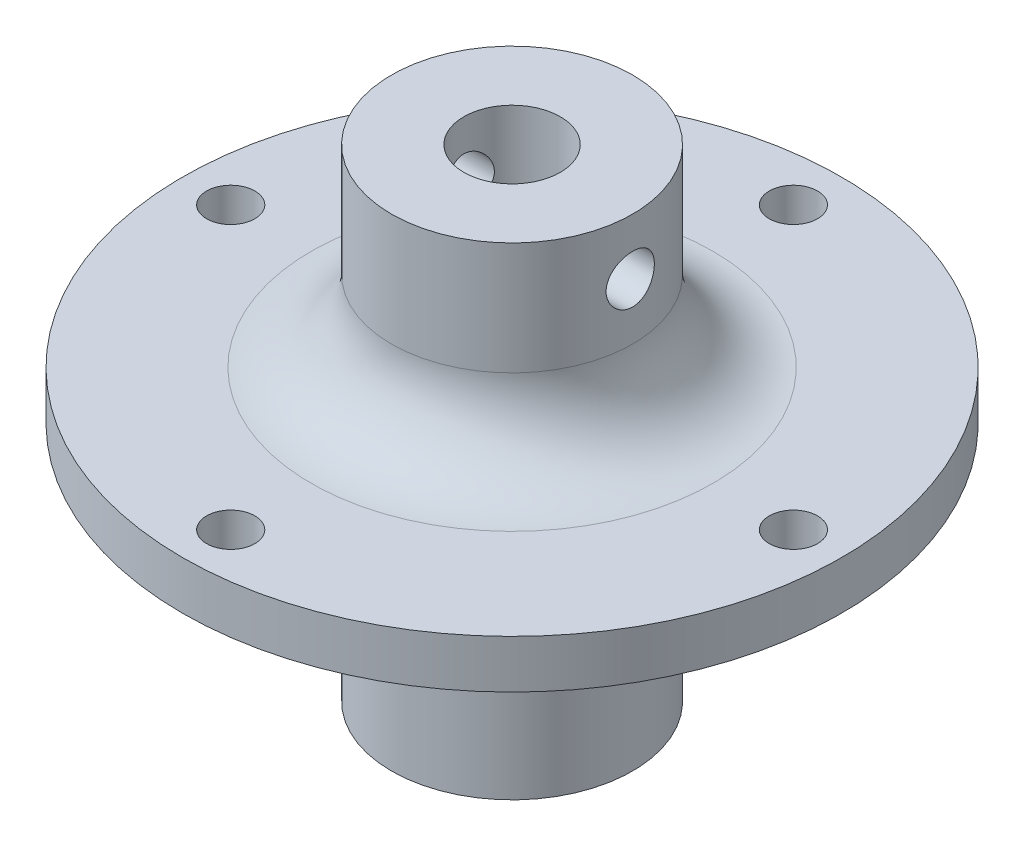
ISO-10303-21;
HEADER;
FILE_DESCRIPTION(('STEP AP214'),'2;1');
FILE_NAME('part.step','',(''),(''),'','','');
FILE_SCHEMA(('AUTOMOTIVE_DESIGN { 1 0 10303 214 1 1 1 1 }'));
ENDSEC;
DATA;
#1=APPLICATION_CONTEXT('core data for automotive mechanical design processes');
#2=APPLICATION_PROTOCOL_DEFINITION('international standard','automotive_design',2000,#1);
#3=PRODUCT_CONTEXT('',#1,'mechanical');
#4=PRODUCT('Part','Part','',(#3));
#5=PRODUCT_RELATED_PRODUCT_CATEGORY('part','',(#4));
#6=PRODUCT_DEFINITION_FORMATION('','',#4);
#7=PRODUCT_DEFINITION_CONTEXT('part definition',#1,'design');
#8=PRODUCT_DEFINITION('design','',#6,#7);
#9=PRODUCT_DEFINITION_SHAPE('','',#8);
#10=(LENGTH_UNIT() NAMED_UNIT(*) SI_UNIT(.MILLI.,.METRE.));
#11=(NAMED_UNIT(*) PLANE_ANGLE_UNIT() SI_UNIT($,.RADIAN.));
#12=(NAMED_UNIT(*) SI_UNIT($,.STERADIAN.) SOLID_ANGLE_UNIT());
#13=UNCERTAINTY_MEASURE_WITH_UNIT(LENGTH_MEASURE(1.E-05),#10,'distance_accuracy_value','');
#14=(GEOMETRIC_REPRESENTATION_CONTEXT(3) GLOBAL_UNCERTAINTY_ASSIGNED_CONTEXT((#13)) GLOBAL_UNIT_ASSIGNED_CONTEXT((#10,
#11,#12)) REPRESENTATION_CONTEXT('',''));
#15=CARTESIAN_POINT('',(0.,0.,0.));
#16=DIRECTION('',(0.,0.,1.));
#17=DIRECTION('',(1.,0.,0.));
#18=AXIS2_PLACEMENT_3D('',#15,#16,#17);
#19=CARTESIAN_POINT('',(0.,9.76768972053728,0.));
#20=DIRECTION('',(0.,1.,0.));
#21=DIRECTION('',(0.,0.,1.));
#22=AXIS2_PLACEMENT_3D('',#19,#20,#21);
#23=CYLINDRICAL_SURFACE('',#22,3.);
#24=CARTESIAN_POINT('',(2.59807621135332,26.5,1.5));
#25=CARTESIAN_POINT('',(2.59808302092689,26.4218382877071,1.4999945446118));
#26=CARTESIAN_POINT('',(2.60165701781635,26.3435778827124,1.49384995609983));
#27=CARTESIAN_POINT('',(2.61543549678079,26.1894591029843,1.46958481484708));
#28=CARTESIAN_POINT('',(2.62565391083339,26.1136061274349,1.45143909683127));
#29=CARTESIAN_POINT('',(2.65124019908098,25.9668225034841,1.40414992304972));
#30=CARTESIAN_POINT('',(2.66658065209878,25.8958680212896,1.3750649287406));
#31=CARTESIAN_POINT('',(2.70063997225287,25.7598636970049,1.30690128806456));
#32=CARTESIAN_POINT('',(2.71935902214097,25.6948141746063,1.26782210105366));
#33=CARTESIAN_POINT('',(2.75995303586162,25.5665414071637,1.17699981079632));
#34=CARTESIAN_POINT('',(2.78196095456931,25.5039112964897,1.12447805421566));
#35=CARTESIAN_POINT('',(2.82557974178559,25.3878874173899,1.0098807114217));
#36=CARTESIAN_POINT('',(2.84719040746875,25.3344982561247,0.94780038867344));
#37=CARTESIAN_POINT('',(2.88932215429424,25.2349492732785,0.810734345121819));
#38=CARTESIAN_POINT('',(2.90967159627259,25.1895193482107,0.735160783518862));
#39=CARTESIAN_POINT('',(2.94526134149294,25.1122887201314,0.576235539899255));
#40=CARTESIAN_POINT('',(2.96050486775613,25.0804794157942,0.492888807207232));
#41=CARTESIAN_POINT('',(2.98320691866356,25.0337430080484,0.327067415888964));
#42=CARTESIAN_POINT('',(2.99114220331338,25.0177757104667,0.244952685733225));
#43=CARTESIAN_POINT('',(3.00011375769101,24.9997508219874,0.0788559430467706));
#44=CARTESIAN_POINT('',(3.00115420176885,24.9976848148064,-0.00512490876560917));
#45=CARTESIAN_POINT('',(2.99644472874675,25.0071200109555,-0.164748786635626));
#46=CARTESIAN_POINT('',(2.99127743838241,25.0174570232818,-0.240481798765188));
#47=CARTESIAN_POINT('',(2.97561367889621,25.049321265857,-0.388970657877483));
#48=CARTESIAN_POINT('',(2.96511681099591,25.0708493334643,-0.461726281640888));
#49=CARTESIAN_POINT('',(2.93957374931482,25.1246238491347,-0.60346408735433));
#50=CARTESIAN_POINT('',(2.92446662293799,25.1570144697581,-0.672380135272768));
#51=CARTESIAN_POINT('',(2.89106468980031,25.2313951243022,-0.803965202269993));
#52=CARTESIAN_POINT('',(2.87276874236226,25.2733885949535,-0.866631973257968));
#53=CARTESIAN_POINT('',(2.83266591598844,25.3703430272995,-0.990260491347291));
#54=CARTESIAN_POINT('',(2.81069063997263,25.426154542489,-1.05050111254404));
#55=CARTESIAN_POINT('',(2.76681510880218,25.5468845873953,-1.16115655544667));
#56=CARTESIAN_POINT('',(2.74491492398444,25.6118100584111,-1.21156381736134));
#57=CARTESIAN_POINT('',(2.70216234138727,25.7539722886361,-1.30425800196332));
#58=CARTESIAN_POINT('',(2.68146479986062,25.8317290345813,-1.34582597246708));
#59=CARTESIAN_POINT('',(2.64563175417864,25.9944065070385,-1.41497866950185));
#60=CARTESIAN_POINT('',(2.63049045069101,26.0793196495263,-1.44257798731633));
#61=CARTESIAN_POINT('',(2.60916953725552,26.2468217669242,-1.48077031653756));
#62=CARTESIAN_POINT('',(2.60237483772745,26.3290616785653,-1.49253768317996));
#63=CARTESIAN_POINT('',(2.59676879042414,26.4946020122748,-1.50227541991714));
#64=CARTESIAN_POINT('',(2.59795180333968,26.5779016436797,-1.50025553597254));
#65=CARTESIAN_POINT('',(2.60751504810877,26.7334808778681,-1.48355406501595));
#66=CARTESIAN_POINT('',(2.61509381259981,26.8059691766619,-1.4702817250687));
#67=CARTESIAN_POINT('',(2.63541032327012,26.9475516794064,-1.43354442694866));
#68=CARTESIAN_POINT('',(2.64814974007551,27.0166447761199,-1.41007616793542));
#69=CARTESIAN_POINT('',(2.67804333119485,27.153116996354,-1.35247138290733));
#70=CARTESIAN_POINT('',(2.69537464864595,27.2202685252803,-1.31789109553909));
#71=CARTESIAN_POINT('',(2.73234179245875,27.3482039073085,-1.23943059602371));
#72=CARTESIAN_POINT('',(2.75197880032721,27.4089844652699,-1.19554560649833));
#73=CARTESIAN_POINT('',(2.79431997684504,27.5304681512853,-1.09325575079828));
#74=CARTESIAN_POINT('',(2.81709874731434,27.5901957260765,-1.03371790847245));
#75=CARTESIAN_POINT('',(2.86101352466839,27.6991183569904,-0.905106743097433));
#76=CARTESIAN_POINT('',(2.88214897511564,27.7483098553458,-0.83603021198302));
#77=CARTESIAN_POINT('',(2.92112042536436,27.8358605889252,-0.687803043838135));
#78=CARTESIAN_POINT('',(2.93885462508044,27.8738996773164,-0.608434646361168));
#79=CARTESIAN_POINT('',(2.96825032438952,27.9357068557861,-0.443283546961621));
#80=CARTESIAN_POINT('',(2.9799171551456,27.9594874770495,-0.357506552088261));
#81=CARTESIAN_POINT('',(2.99501262272824,27.990052846262,-0.190469523495623));
#82=CARTESIAN_POINT('',(2.99909891862287,27.9981968138142,-0.109517165775683));
#83=CARTESIAN_POINT('',(3.00063195562697,28.0012648981816,0.0526889789268073));
#84=CARTESIAN_POINT('',(2.99808102100335,27.9961936427853,0.133942650442632));
#85=CARTESIAN_POINT('',(2.98700953256884,27.9738753898066,0.288806988475722));
#86=CARTESIAN_POINT('',(2.97889342001985,27.9574527261135,0.362568476716897));
#87=CARTESIAN_POINT('',(2.95788140495135,27.9140095010455,0.506168928275427));
#88=CARTESIAN_POINT('',(2.94498481699194,27.8869874198598,0.576007327433264));
#89=CARTESIAN_POINT('',(2.9148889612218,27.821909421751,0.713135109367328));
#90=CARTESIAN_POINT('',(2.89752925798199,27.7834310151882,0.780187714050071));
#91=CARTESIAN_POINT('',(2.86032199712739,27.6970631037114,0.907161962721038));
#92=CARTESIAN_POINT('',(2.84047329837541,27.6491692763265,0.967080311122361));
#93=CARTESIAN_POINT('',(2.79792915339942,27.5398042914659,1.08437100623534));
#94=CARTESIAN_POINT('',(2.77514698517547,27.4774562687842,1.14089652680891));
#95=CARTESIAN_POINT('',(2.73094614244279,27.3438239183053,1.24299493109201));
#96=CARTESIAN_POINT('',(2.70952868642798,27.2725317686985,1.28855812501509));
#97=CARTESIAN_POINT('',(2.66999407957374,27.1200450301286,1.36864661967848));
#98=CARTESIAN_POINT('',(2.65200261384405,27.0386087033069,1.40277759894141));
#99=CARTESIAN_POINT('',(2.62299234492527,26.8700013934903,1.45631806425962));
#100=CARTESIAN_POINT('',(2.61195024221553,26.782850666631,1.47577678676302));
#101=CARTESIAN_POINT('',(2.60293908902686,26.662291966522,1.49155051179662));
#102=CARTESIAN_POINT('',(2.60112193507728,26.6299481584032,1.49471415744578));
#103=CARTESIAN_POINT('',(2.59868903831625,26.5650752789766,1.49894010763495));
#104=CARTESIAN_POINT('',(2.59807337587664,26.5325461954212,1.50000227159981));
#105=CARTESIAN_POINT('',(2.59807621135332,26.5,1.5));
#106=B_SPLINE_CURVE_WITH_KNOTS('',3,(#24,#25,#26,#27,#28,#29,#30,#31,#32,#33,#34,#35,#36,#37,
#38,#39,#40,#41,#42,#43,#44,#45,#46,#47,#48,#49,#50,#51,#52,#53,#54,#55,#56,#57,#58,#59,#60,#61,
#62,#63,#64,#65,#66,#67,#68,#69,#70,#71,#72,#73,#74,#75,#76,#77,#78,#79,#80,#81,#82,#83,#84,#85,
#86,#87,#88,#89,#90,#91,#92,#93,#94,#95,#96,#97,#98,#99,#100,#101,#102,#103,#104,#105),
.UNSPECIFIED.,.T.,.F.,(4,2,2,2,2,2,2,2,2,2,2,2,2,2,2,2,2,2,2,2,2,2,2,2,2,2,2,2,2,2,2,2,2,2,2,2,
2,2,2,2,4),(0.,0.234348183892075,0.469189339237207,0.702792893878331,0.936409088167727,
1.18929346874735,1.44230356626557,1.71236838358145,1.98226240445837,2.23295227451903,
2.4834903552906,2.71224146226808,2.94100968776183,3.1729430209672,3.40495949025408,
3.65890787185336,3.91305072368878,4.18333262594173,4.45333161317557,4.70193436281318,
4.9503613978256,5.17161275136038,5.39293578654095,5.62450944609131,5.85620229330071,
6.1171011537092,6.37808797467304,6.64596272119449,6.91360169713158,7.15668405584231,
7.39968130190958,7.62666637307239,7.8536840026802,8.09041126079208,8.32724745151079,
8.58765362775102,8.84828914267732,9.11716123557908,9.38512699504141,9.48270202777965,
9.58028358741811),.UNSPECIFIED.);
#107=CARTESIAN_POINT('',(2.59807621135332,26.5,1.5));
#108=VERTEX_POINT('',#107);
#109=EDGE_CURVE('E99',#108,#108,#106,.T.);
#110=ORIENTED_EDGE('',*,*,#109,.T.);
#111=EDGE_LOOP('',(#110));
#112=FACE_BOUND('',#111,.T.);
#113=CARTESIAN_POINT('',(-2.59807621135331,26.5,1.5));
#114=CARTESIAN_POINT('',(-2.59808302092688,26.5781617122929,1.4999945446118));
#115=CARTESIAN_POINT('',(-2.60165701781635,26.6564221172876,1.49384995609983));
#116=CARTESIAN_POINT('',(-2.61543549678079,26.8105408970157,1.46958481484708));
#117=CARTESIAN_POINT('',(-2.62565391083339,26.8863938725651,1.45143909683127));
#118=CARTESIAN_POINT('',(-2.65124019908098,27.0331774965159,1.40414992304972));
#119=CARTESIAN_POINT('',(-2.66658065209878,27.1041319787104,1.3750649287406));
#120=CARTESIAN_POINT('',(-2.70063997225287,27.2401363029951,1.30690128806456));
#121=CARTESIAN_POINT('',(-2.71935902214097,27.3051858253937,1.26782210105366));
#122=CARTESIAN_POINT('',(-2.75995303586162,27.4334585928363,1.17699981079632));
#123=CARTESIAN_POINT('',(-2.7819609545693,27.4960887035103,1.12447805421566));
#124=CARTESIAN_POINT('',(-2.82557974178559,27.6121125826101,1.00988071142171));
#125=CARTESIAN_POINT('',(-2.84719040746875,27.6655017438753,0.947800388673444));
#126=CARTESIAN_POINT('',(-2.88932215429424,27.7650507267215,0.810734345121824));
#127=CARTESIAN_POINT('',(-2.90967159627259,27.8104806517893,0.735160783518867));
#128=CARTESIAN_POINT('',(-2.94526134149294,27.8877112798686,0.57623553989926));
#129=CARTESIAN_POINT('',(-2.96050486775613,27.9195205842058,0.492888807207236));
#130=CARTESIAN_POINT('',(-2.98320691866356,27.9662569919516,0.327067415888968));
#131=CARTESIAN_POINT('',(-2.99114220331338,27.9822242895333,0.244952685733228));
#132=CARTESIAN_POINT('',(-3.00011375769101,28.0002491780126,0.0788559430467736));
#133=CARTESIAN_POINT('',(-3.00115420176885,28.0023151851936,-0.00512490876560667));
#134=CARTESIAN_POINT('',(-2.99644472874675,27.9928799890445,-0.164748786635625));
#135=CARTESIAN_POINT('',(-2.99127743838241,27.9825429767182,-0.240481798765187));
#136=CARTESIAN_POINT('',(-2.97561367889621,27.950678734143,-0.388970657877483));
#137=CARTESIAN_POINT('',(-2.96511681099591,27.9291506665357,-0.461726281640888));
#138=CARTESIAN_POINT('',(-2.93957374931482,27.8753761508653,-0.603464087354331));
#139=CARTESIAN_POINT('',(-2.92446662293799,27.8429855302419,-0.672380135272769));
#140=CARTESIAN_POINT('',(-2.89106468980031,27.7686048756978,-0.803965202269994));
#141=CARTESIAN_POINT('',(-2.87276874236226,27.7266114050465,-0.866631973257969));
#142=CARTESIAN_POINT('',(-2.83266591598844,27.6296569727005,-0.990260491347293));
#143=CARTESIAN_POINT('',(-2.81069063997263,27.573845457511,-1.05050111254404));
#144=CARTESIAN_POINT('',(-2.76681510880218,27.4531154126047,-1.16115655544667));
#145=CARTESIAN_POINT('',(-2.74491492398443,27.3881899415889,-1.21156381736135));
#146=CARTESIAN_POINT('',(-2.70216234138727,27.2460277113639,-1.30425800196332));
#147=CARTESIAN_POINT('',(-2.68146479986062,27.1682709654187,-1.34582597246708));
#148=CARTESIAN_POINT('',(-2.64563175417864,27.0055934929615,-1.41497866950185));
#149=CARTESIAN_POINT('',(-2.63049045069101,26.9206803504737,-1.44257798731634));
#150=CARTESIAN_POINT('',(-2.60916953725552,26.7531782330758,-1.48077031653756));
#151=CARTESIAN_POINT('',(-2.60237483772745,26.6709383214347,-1.49253768317996));
#152=CARTESIAN_POINT('',(-2.59676879042414,26.5053979877252,-1.50227541991714));
#153=CARTESIAN_POINT('',(-2.59795180333968,26.4220983563203,-1.50025553597254));
#154=CARTESIAN_POINT('',(-2.60751504810877,26.2665191221319,-1.48355406501595));
#155=CARTESIAN_POINT('',(-2.61509381259981,26.1940308233381,-1.4702817250687));
#156=CARTESIAN_POINT('',(-2.63541032327012,26.0524483205936,-1.43354442694866));
#157=CARTESIAN_POINT('',(-2.64814974007551,25.9833552238801,-1.41007616793542));
#158=CARTESIAN_POINT('',(-2.67804333119485,25.846883003646,-1.35247138290733));
#159=CARTESIAN_POINT('',(-2.69537464864595,25.7797314747197,-1.31789109553909));
#160=CARTESIAN_POINT('',(-2.73234179245875,25.6517960926915,-1.23943059602371));
#161=CARTESIAN_POINT('',(-2.75197880032721,25.5910155347301,-1.19554560649833));
#162=CARTESIAN_POINT('',(-2.79431997684504,25.4695318487147,-1.09325575079828));
#163=CARTESIAN_POINT('',(-2.81709874731434,25.4098042739235,-1.03371790847245));
#164=CARTESIAN_POINT('',(-2.86101352466839,25.3008816430096,-0.905106743097437));
#165=CARTESIAN_POINT('',(-2.88214897511564,25.2516901446542,-0.836030211983024));
#166=CARTESIAN_POINT('',(-2.92112042536435,25.1641394110748,-0.68780304383814));
#167=CARTESIAN_POINT('',(-2.93885462508044,25.1261003226836,-0.608434646361174));
#168=CARTESIAN_POINT('',(-2.96825032438952,25.0642931442139,-0.443283546961627));
#169=CARTESIAN_POINT('',(-2.9799171551456,25.0405125229505,-0.357506552088267));
#170=CARTESIAN_POINT('',(-2.99501262272824,25.009947153738,-0.190469523495628));
#171=CARTESIAN_POINT('',(-2.99909891862287,25.0018031861858,-0.109517165775687));
#172=CARTESIAN_POINT('',(-3.00063195562697,24.9987351018184,0.0526889789268042));
#173=CARTESIAN_POINT('',(-2.99808102100335,25.0038063572146,0.13394265044263));
#174=CARTESIAN_POINT('',(-2.98700953256884,25.0261246101934,0.28880698847572));
#175=CARTESIAN_POINT('',(-2.97889342001985,25.0425472738865,0.362568476716895));
#176=CARTESIAN_POINT('',(-2.95788140495135,25.0859904989545,0.506168928275426));
#177=CARTESIAN_POINT('',(-2.94498481699194,25.1130125801402,0.576007327433263));
#178=CARTESIAN_POINT('',(-2.9148889612218,25.178090578249,0.713135109367327));
#179=CARTESIAN_POINT('',(-2.89752925798199,25.2165689848118,0.780187714050069));
#180=CARTESIAN_POINT('',(-2.86032199712739,25.3029368962886,0.907161962721037));
#181=CARTESIAN_POINT('',(-2.84047329837541,25.3508307236735,0.967080311122361));
#182=CARTESIAN_POINT('',(-2.79792915339942,25.4601957085341,1.08437100623534));
#183=CARTESIAN_POINT('',(-2.77514698517547,25.5225437312158,1.14089652680891));
#184=CARTESIAN_POINT('',(-2.73094614244279,25.6561760816947,1.24299493109201));
#185=CARTESIAN_POINT('',(-2.70952868642798,25.7274682313015,1.28855812501509));
#186=CARTESIAN_POINT('',(-2.66999407957374,25.8799549698714,1.36864661967848));
#187=CARTESIAN_POINT('',(-2.65200261384406,25.9613912966931,1.40277759894141));
#188=CARTESIAN_POINT('',(-2.62299234492527,26.1299986065097,1.45631806425962));
#189=CARTESIAN_POINT('',(-2.61195024221553,26.217149333369,1.47577678676302));
#190=CARTESIAN_POINT('',(-2.60293908902686,26.337708033478,1.49155051179662));
#191=CARTESIAN_POINT('',(-2.60112193507728,26.3700518415968,1.49471415744578));
#192=CARTESIAN_POINT('',(-2.59868903831625,26.4349247210234,1.49894010763495));
#193=CARTESIAN_POINT('',(-2.59807337587664,26.4674538045788,1.50000227159981));
#194=CARTESIAN_POINT('',(-2.59807621135331,26.5,1.5));
#195=B_SPLINE_CURVE_WITH_KNOTS('',3,(#113,#114,#115,#116,#117,#118,#119,#120,#121,#122,#123,
#124,#125,#126,#127,#128,#129,#130,#131,#132,#133,#134,#135,#136,#137,#138,#139,#140,#141,#142,
#143,#144,#145,#146,#147,#148,#149,#150,#151,#152,#153,#154,#155,#156,#157,#158,#159,#160,#161,
#162,#163,#164,#165,#166,#167,#168,#169,#170,#171,#172,#173,#174,#175,#176,#177,#178,#179,#180,
#181,#182,#183,#184,#185,#186,#187,#188,#189,#190,#191,#192,#193,#194),.UNSPECIFIED.,.T.,.F.,(4,
2,2,2,2,2,2,2,2,2,2,2,2,2,2,2,2,2,2,2,2,2,2,2,2,2,2,2,2,2,2,2,2,2,2,2,2,2,2,2,4),(0.,
0.234348183892075,0.469189339237207,0.702792893878328,0.936409088167723,1.18929346874735,
1.44230356626556,1.71236838358145,1.98226240445836,2.23295227451903,2.4834903552906,
2.71224146226808,2.94100968776183,3.1729430209672,3.40495949025408,3.65890787185336,
3.91305072368878,4.18333262594173,4.45333161317558,4.70193436281318,4.9503613978256,
5.17161275136038,5.39293578654095,5.62450944609131,5.85620229330071,6.1171011537092,
6.37808797467303,6.64596272119448,6.91360169713157,7.1566840558423,7.39968130190958,
7.62666637307239,7.8536840026802,8.09041126079208,8.32724745151079,8.58765362775102,
8.84828914267732,9.11716123557908,9.38512699504141,9.48270202777965,9.58028358741812),.UNSPECIFIED.);
#196=CARTESIAN_POINT('',(-2.59807621135331,26.5,1.5));
#197=VERTEX_POINT('',#196);
#198=EDGE_CURVE('E94',#197,#197,#195,.T.);
#199=ORIENTED_EDGE('',*,*,#198,.T.);
#200=EDGE_LOOP('',(#199));
#201=FACE_BOUND('',#200,.T.);
#202=CARTESIAN_POINT('',(0.,0.,0.));
#203=DIRECTION('',(0.,1.,0.));
#204=DIRECTION('',(0.,0.,1.));
#205=AXIS2_PLACEMENT_3D('',#202,#203,#204);
#206=CIRCLE('',#205,3.);
#207=CARTESIAN_POINT('',(0.,0.,3.));
#208=VERTEX_POINT('',#207);
#209=EDGE_CURVE('E71',#208,#208,#206,.T.);
#210=ORIENTED_EDGE('',*,*,#209,.F.);
#211=EDGE_LOOP('',(#210));
#212=FACE_BOUND('',#211,.T.);
#213=CARTESIAN_POINT('',(0.,30.,0.));
#214=DIRECTION('',(0.,1.,0.));
#215=DIRECTION('',(0.,0.,1.));
#216=AXIS2_PLACEMENT_3D('',#213,#214,#215);
#217=CIRCLE('',#216,3.);
#218=CARTESIAN_POINT('',(0.,30.,3.));
#219=VERTEX_POINT('',#218);
#220=EDGE_CURVE('E55',#219,#219,#217,.T.);
#221=ORIENTED_EDGE('',*,*,#220,.T.);
#222=EDGE_LOOP('',(#221));
#223=FACE_BOUND('',#222,.T.);
#224=ADVANCED_FACE('F37',(#112,#201,#212,#223),#23,.F.);
#225=CARTESIAN_POINT('',(3.,30.,0.));
#226=DIRECTION('',(0.,-1.,0.));
#227=DIRECTION('',(0.,0.,-1.));
#228=AXIS2_PLACEMENT_3D('',#225,#226,#227);
#229=PLANE('',#228);
#230=ORIENTED_EDGE('',*,*,#220,.F.);
#231=EDGE_LOOP('',(#230));
#232=FACE_BOUND('',#231,.T.);
#233=CARTESIAN_POINT('',(0.,30.,0.));
#234=DIRECTION('',(0.,1.,0.));
#235=DIRECTION('',(0.,0.,1.));
#236=AXIS2_PLACEMENT_3D('',#233,#234,#235);
#237=CIRCLE('',#236,7.5);
#238=CARTESIAN_POINT('',(0.,30.,7.5));
#239=VERTEX_POINT('',#238);
#240=EDGE_CURVE('E121',#239,#239,#237,.T.);
#241=ORIENTED_EDGE('',*,*,#240,.T.);
#242=EDGE_LOOP('',(#241));
#243=FACE_BOUND('',#242,.T.);
#244=ADVANCED_FACE('F106',(#232,#243),#229,.F.);
#245=CARTESIAN_POINT('',(0.,9.76768972053728,0.));
#246=DIRECTION('',(0.,1.,0.));
#247=DIRECTION('',(0.,0.,1.));
#248=AXIS2_PLACEMENT_3D('',#245,#246,#247);
#249=CYLINDRICAL_SURFACE('',#248,7.5);
#250=CARTESIAN_POINT('',(7.34846922834954,26.5,1.5));
#251=CARTESIAN_POINT('',(7.3484708853835,26.5833465632358,1.49999691881235));
#252=CARTESIAN_POINT('',(7.34990262402618,26.6667319349997,1.49302975757707));
#253=CARTESIAN_POINT('',(7.35546646957746,26.831143757715,1.46536842537441));
#254=CARTESIAN_POINT('',(7.35960073717297,26.912168266954,1.44466327060578));
#255=CARTESIAN_POINT('',(7.37008310582665,27.0694559550312,1.39019367392958));
#256=CARTESIAN_POINT('',(7.37642900431582,27.1457237822989,1.35644222122892));
#257=CARTESIAN_POINT('',(7.39061699221019,27.2915122670455,1.27687366150577));
#258=CARTESIAN_POINT('',(7.398458998102,27.3610333008069,1.23105722790173));
#259=CARTESIAN_POINT('',(7.4148794954137,27.4923415057808,1.12796861348015));
#260=CARTESIAN_POINT('',(7.42346606755867,27.554019381826,1.07055848386998));
#261=CARTESIAN_POINT('',(7.440337084539,27.6669363003685,0.946210183531965));
#262=CARTESIAN_POINT('',(7.44862150816248,27.7181746111258,0.879271345466976));
#263=CARTESIAN_POINT('',(7.46404194626342,27.8091820264427,0.737042033886383));
#264=CARTESIAN_POINT('',(7.47116732162326,27.848847270725,0.661683851508315));
#265=CARTESIAN_POINT('',(7.48337605325447,27.9149124055722,0.505206225580907));
#266=CARTESIAN_POINT('',(7.48845960066179,27.9413135378515,0.42408732213083));
#267=CARTESIAN_POINT('',(7.49595481032627,27.9797607904294,0.259525159917742));
#268=CARTESIAN_POINT('',(7.4984007943219,27.9919914663565,0.176126608822221));
#269=CARTESIAN_POINT('',(7.50046381775405,28.0023264277575,0.00842785265630449));
#270=CARTESIAN_POINT('',(7.50008112979138,28.0004320744687,-0.0758722647477648));
#271=CARTESIAN_POINT('',(7.49655652302773,27.9827107296767,-0.241713001115383));
#272=CARTESIAN_POINT('',(7.49345397548757,27.9670825342482,-0.323275821447705));
#273=CARTESIAN_POINT('',(7.48488265739112,27.9226524513117,-0.482597439870452));
#274=CARTESIAN_POINT('',(7.47941379216058,27.8938500367122,-0.560356085620694));
#275=CARTESIAN_POINT('',(7.46665944029937,27.8237049397791,-0.710429194801331));
#276=CARTESIAN_POINT('',(7.45936272262835,27.7822843733427,-0.78270626120085));
#277=CARTESIAN_POINT('',(7.44375704210678,27.6881363841451,-0.919357568789633));
#278=CARTESIAN_POINT('',(7.43544796282833,27.6354076603442,-0.983730899287501));
#279=CARTESIAN_POINT('',(7.41856446546689,27.5190495668373,-1.10392714658019));
#280=CARTESIAN_POINT('',(7.40998794686274,27.4552462199056,-1.15958147486045));
#281=CARTESIAN_POINT('',(7.39367357398141,27.3191253363239,-1.25942773976521));
#282=CARTESIAN_POINT('',(7.38593573556822,27.2468076386752,-1.30361945959163));
#283=CARTESIAN_POINT('',(7.37217071209385,27.0954687522673,-1.37934422220282));
#284=CARTESIAN_POINT('',(7.36614722345323,27.0164335485405,-1.41084997166656));
#285=CARTESIAN_POINT('',(7.35654714481909,26.854043014414,-1.46008551244137));
#286=CARTESIAN_POINT('',(7.35297023592641,26.7706882485714,-1.47781709918496));
#287=CARTESIAN_POINT('',(7.34873218901741,26.6035527130014,-1.49874900905408));
#288=CARTESIAN_POINT('',(7.34802220585731,26.5198036385345,-1.50219278834687));
#289=CARTESIAN_POINT('',(7.34946728533281,26.3529276652005,-1.49510644246611));
#290=CARTESIAN_POINT('',(7.35162218550582,26.2698007313217,-1.48457710968366));
#291=CARTESIAN_POINT('',(7.35850848742372,26.1073470395616,-1.45005331211124));
#292=CARTESIAN_POINT('',(7.36321498521745,26.0279914854464,-1.42618893125895));
#293=CARTESIAN_POINT('',(7.37465234027497,25.8744050814569,-1.36581155296278));
#294=CARTESIAN_POINT('',(7.38138336429404,25.8001746543464,-1.32929751355977));
#295=CARTESIAN_POINT('',(7.39622108943059,25.6578803350748,-1.2441062133234));
#296=CARTESIAN_POINT('',(7.40434457797355,25.5899094305488,-1.19527661697413));
#297=CARTESIAN_POINT('',(7.42100585739954,25.4630375319986,-1.08704335831907));
#298=CARTESIAN_POINT('',(7.42954369085727,25.4041374726261,-1.02763860771681));
#299=CARTESIAN_POINT('',(7.44623018803823,25.2961561612216,-0.898848410246837));
#300=CARTESIAN_POINT('',(7.45437086563026,25.247239518025,-0.829323748394445));
#301=CARTESIAN_POINT('',(7.4692069144293,25.1617811777506,-0.682901844952132));
#302=CARTESIAN_POINT('',(7.47590234632816,25.1252389609828,-0.606004913150259));
#303=CARTESIAN_POINT('',(7.487059410916,25.06580669238,-0.447454021236017));
#304=CARTESIAN_POINT('',(7.49153368713906,25.0428392226606,-0.365830010217115));
#305=CARTESIAN_POINT('',(7.4977985390649,25.0109631285042,-0.199784182019867));
#306=CARTESIAN_POINT('',(7.49958943799765,25.0020528107865,-0.11536270306682));
#307=CARTESIAN_POINT('',(7.50027810681181,24.9986095285557,0.0523093408554358));
#308=CARTESIAN_POINT('',(7.49922567824026,25.0038290793157,0.135554718212254));
#309=CARTESIAN_POINT('',(7.49445065340476,25.0279509258217,0.299956546973462));
#310=CARTESIAN_POINT('',(7.49072809071528,25.0468530495221,0.381113024630537));
#311=CARTESIAN_POINT('',(7.481032475475,25.0976934881375,0.538879124617644));
#312=CARTESIAN_POINT('',(7.47506455871865,25.1296020671968,0.61549866486042));
#313=CARTESIAN_POINT('',(7.46152083185077,25.2055183619963,0.762331830278928));
#314=CARTESIAN_POINT('',(7.45394489468828,25.2495270338556,0.832544948651117));
#315=CARTESIAN_POINT('',(7.43786398736791,25.3492290805931,0.965795835159537));
#316=CARTESIAN_POINT('',(7.4293460013317,25.4050995045802,1.02869957417476));
#317=CARTESIAN_POINT('',(7.41241834355477,25.5265753601437,1.14432392663527));
#318=CARTESIAN_POINT('',(7.40400869794476,25.5921830942031,1.19704212480408));
#319=CARTESIAN_POINT('',(7.3881501412478,25.7321189750503,1.29133832918279));
#320=CARTESIAN_POINT('',(7.38071255446371,25.8065334417407,1.33279022195961));
#321=CARTESIAN_POINT('',(7.36777855777287,25.9613991599494,1.40253607393175));
#322=CARTESIAN_POINT('',(7.36228038807748,26.0418448580463,1.43084196896908));
#323=CARTESIAN_POINT('',(7.3549452169166,26.1853936831552,1.4680037097813));
#324=CARTESIAN_POINT('',(7.35253177367824,26.2476781292685,1.47998084778413));
#325=CARTESIAN_POINT('',(7.34929317692711,26.3733009318291,1.49598002694097));
#326=CARTESIAN_POINT('',(7.34846796865859,26.4366392518674,1.50000234234439));
#327=CARTESIAN_POINT('',(7.34846922834954,26.5,1.5));
#328=B_SPLINE_CURVE_WITH_KNOTS('',3,(#250,#251,#252,#253,#254,#255,#256,#257,#258,#259,#260,
#261,#262,#263,#264,#265,#266,#267,#268,#269,#270,#271,#272,#273,#274,#275,#276,#277,#278,#279,
#280,#281,#282,#283,#284,#285,#286,#287,#288,#289,#290,#291,#292,#293,#294,#295,#296,#297,#298,
#299,#300,#301,#302,#303,#304,#305,#306,#307,#308,#309,#310,#311,#312,#313,#314,#315,#316,#317,
#318,#319,#320,#321,#322,#323,#324,#325,#326,#327),.UNSPECIFIED.,.T.,.F.,(4,2,2,2,2,2,2,2,2,2,2,
2,2,2,2,2,2,2,2,2,2,2,2,2,2,2,2,2,2,2,2,2,2,2,2,2,2,2,4),(0.,0.249807695804142,
0.499815358926445,0.74957474691088,0.999320197289797,1.25223378822655,1.50516510053133,
1.76030100656176,2.0154130236984,2.26716373324621,2.51889018174373,2.76703184450306,
3.01518343610626,3.26489886333455,3.51464303655099,3.76874020143725,4.02284217184081,
4.27748794759164,4.53210052524037,4.78235636706891,5.03259801792632,5.28044012674979,
5.52830265531598,5.77939589661782,6.03051499305313,6.28548902600176,6.54045234945158,
6.79394720367976,7.04741152037442,7.29646526122029,7.54551587050135,7.79400025613178,
8.04250428202026,8.29501728038396,8.54759008334672,8.80288347868562,9.05794462633399,
9.24785705455344,9.43776293526322),.UNSPECIFIED.);
#329=CARTESIAN_POINT('',(7.34846922834954,26.5,1.5));
#330=VERTEX_POINT('',#329);
#331=EDGE_CURVE('E41',#330,#330,#328,.T.);
#332=ORIENTED_EDGE('',*,*,#331,.T.);
#333=EDGE_LOOP('',(#332));
#334=FACE_BOUND('',#333,.T.);
#335=CARTESIAN_POINT('',(-7.34846922834953,26.5,1.5));
#336=CARTESIAN_POINT('',(-7.34847088538349,26.4166534367642,1.49999691881235));
#337=CARTESIAN_POINT('',(-7.34990262402618,26.3332680650002,1.49302975757707));
#338=CARTESIAN_POINT('',(-7.35546646957746,26.168856242285,1.46536842537441));
#339=CARTESIAN_POINT('',(-7.35960073717297,26.087831733046,1.44466327060578));
#340=CARTESIAN_POINT('',(-7.37008310582665,25.9305440449688,1.39019367392958));
#341=CARTESIAN_POINT('',(-7.37642900431582,25.8542762177011,1.35644222122892));
#342=CARTESIAN_POINT('',(-7.39061699221019,25.7084877329545,1.27687366150577));
#343=CARTESIAN_POINT('',(-7.398458998102,25.6389666991931,1.23105722790173));
#344=CARTESIAN_POINT('',(-7.4148794954137,25.5076584942192,1.12796861348015));
#345=CARTESIAN_POINT('',(-7.42346606755867,25.445980618174,1.07055848386998));
#346=CARTESIAN_POINT('',(-7.440337084539,25.3330636996315,0.946210183531967));
#347=CARTESIAN_POINT('',(-7.44862150816248,25.2818253888742,0.879271345466977));
#348=CARTESIAN_POINT('',(-7.46404194626342,25.1908179735573,0.737042033886384));
#349=CARTESIAN_POINT('',(-7.47116732162326,25.151152729275,0.661683851508317));
#350=CARTESIAN_POINT('',(-7.48337605325447,25.0850875944278,0.505206225580908));
#351=CARTESIAN_POINT('',(-7.48845960066179,25.0586864621485,0.42408732213083));
#352=CARTESIAN_POINT('',(-7.49595481032627,25.0202392095706,0.259525159917742));
#353=CARTESIAN_POINT('',(-7.4984007943219,25.0080085336435,0.176126608822221));
#354=CARTESIAN_POINT('',(-7.50046381775405,24.9976735722425,0.00842785265630477));
#355=CARTESIAN_POINT('',(-7.50008112979138,24.9995679255313,-0.0758722647477643));
#356=CARTESIAN_POINT('',(-7.49655652302773,25.0172892703233,-0.241713001115383));
#357=CARTESIAN_POINT('',(-7.49345397548757,25.0329174657518,-0.323275821447705));
#358=CARTESIAN_POINT('',(-7.48488265739112,25.0773475486883,-0.482597439870452));
#359=CARTESIAN_POINT('',(-7.47941379216058,25.1061499632878,-0.560356085620694));
#360=CARTESIAN_POINT('',(-7.46665944029937,25.1762950602209,-0.710429194801331));
#361=CARTESIAN_POINT('',(-7.45936272262835,25.2177156266573,-0.78270626120085));
#362=CARTESIAN_POINT('',(-7.44375704210678,25.3118636158549,-0.919357568789634));
#363=CARTESIAN_POINT('',(-7.43544796282833,25.3645923396558,-0.983730899287502));
#364=CARTESIAN_POINT('',(-7.41856446546689,25.4809504331627,-1.10392714658019));
#365=CARTESIAN_POINT('',(-7.40998794686274,25.5447537800944,-1.15958147486045));
#366=CARTESIAN_POINT('',(-7.39367357398141,25.6808746636761,-1.25942773976521));
#367=CARTESIAN_POINT('',(-7.38593573556822,25.7531923613248,-1.30361945959163));
#368=CARTESIAN_POINT('',(-7.37217071209385,25.9045312477327,-1.37934422220282));
#369=CARTESIAN_POINT('',(-7.36614722345323,25.9835664514595,-1.41084997166656));
#370=CARTESIAN_POINT('',(-7.35654714481909,26.145956985586,-1.46008551244137));
#371=CARTESIAN_POINT('',(-7.35297023592641,26.2293117514286,-1.47781709918496));
#372=CARTESIAN_POINT('',(-7.34873218901741,26.3964472869986,-1.49874900905408));
#373=CARTESIAN_POINT('',(-7.34802220585731,26.4801963614655,-1.50219278834687));
#374=CARTESIAN_POINT('',(-7.34946728533281,26.6470723347995,-1.49510644246611));
#375=CARTESIAN_POINT('',(-7.35162218550582,26.7301992686783,-1.48457710968366));
#376=CARTESIAN_POINT('',(-7.35850848742372,26.8926529604384,-1.45005331211124));
#377=CARTESIAN_POINT('',(-7.36321498521745,26.9720085145536,-1.42618893125895));
#378=CARTESIAN_POINT('',(-7.37465234027497,27.1255949185431,-1.36581155296278));
#379=CARTESIAN_POINT('',(-7.38138336429404,27.1998253456536,-1.32929751355977));
#380=CARTESIAN_POINT('',(-7.39622108943059,27.3421196649252,-1.2441062133234));
#381=CARTESIAN_POINT('',(-7.40434457797355,27.4100905694512,-1.19527661697413));
#382=CARTESIAN_POINT('',(-7.42100585739954,27.5369624680014,-1.08704335831907));
#383=CARTESIAN_POINT('',(-7.42954369085727,27.5958625273739,-1.02763860771681));
#384=CARTESIAN_POINT('',(-7.44623018803823,27.7038438387784,-0.898848410246837));
#385=CARTESIAN_POINT('',(-7.45437086563026,27.752760481975,-0.829323748394446));
#386=CARTESIAN_POINT('',(-7.4692069144293,27.8382188222494,-0.682901844952134));
#387=CARTESIAN_POINT('',(-7.47590234632816,27.8747610390172,-0.606004913150261));
#388=CARTESIAN_POINT('',(-7.487059410916,27.9341933076199,-0.44745402123602));
#389=CARTESIAN_POINT('',(-7.49153368713906,27.9571607773394,-0.365830010217117));
#390=CARTESIAN_POINT('',(-7.4977985390649,27.9890368714958,-0.199784182019869));
#391=CARTESIAN_POINT('',(-7.49958943799765,27.9979471892135,-0.115362703066821));
#392=CARTESIAN_POINT('',(-7.50027810681181,28.0013904714443,0.0523093408554364));
#393=CARTESIAN_POINT('',(-7.49922567824026,27.9961709206843,0.135554718212255));
#394=CARTESIAN_POINT('',(-7.49445065340476,27.9720490741783,0.299956546973463));
#395=CARTESIAN_POINT('',(-7.49072809071528,27.9531469504779,0.381113024630537));
#396=CARTESIAN_POINT('',(-7.481032475475,27.9023065118625,0.538879124617645));
#397=CARTESIAN_POINT('',(-7.47506455871865,27.8703979328032,0.615498664860422));
#398=CARTESIAN_POINT('',(-7.46152083185077,27.7944816380036,0.76233183027893));
#399=CARTESIAN_POINT('',(-7.45394489468828,27.7504729661444,0.832544948651118));
#400=CARTESIAN_POINT('',(-7.43786398736791,27.6507709194069,0.965795835159536));
#401=CARTESIAN_POINT('',(-7.4293460013317,27.5949004954198,1.02869957417475));
#402=CARTESIAN_POINT('',(-7.41241834355477,27.4734246398563,1.14432392663527));
#403=CARTESIAN_POINT('',(-7.40400869794476,27.4078169057969,1.19704212480408));
#404=CARTESIAN_POINT('',(-7.3881501412478,27.2678810249497,1.29133832918279));
#405=CARTESIAN_POINT('',(-7.38071255446371,27.1934665582593,1.33279022195961));
#406=CARTESIAN_POINT('',(-7.36777855777287,27.0386008400506,1.40253607393175));
#407=CARTESIAN_POINT('',(-7.36228038807748,26.9581551419537,1.43084196896908));
#408=CARTESIAN_POINT('',(-7.3549452169166,26.8146063168447,1.4680037097813));
#409=CARTESIAN_POINT('',(-7.35253177367824,26.7523218707315,1.47998084778413));
#410=CARTESIAN_POINT('',(-7.34929317692711,26.6266990681708,1.49598002694097));
#411=CARTESIAN_POINT('',(-7.34846796865858,26.5633607481326,1.50000234234439));
#412=CARTESIAN_POINT('',(-7.34846922834953,26.5,1.5));
#413=B_SPLINE_CURVE_WITH_KNOTS('',3,(#335,#336,#337,#338,#339,#340,#341,#342,#343,#344,#345,
#346,#347,#348,#349,#350,#351,#352,#353,#354,#355,#356,#357,#358,#359,#360,#361,#362,#363,#364,
#365,#366,#367,#368,#369,#370,#371,#372,#373,#374,#375,#376,#377,#378,#379,#380,#381,#382,#383,
#384,#385,#386,#387,#388,#389,#390,#391,#392,#393,#394,#395,#396,#397,#398,#399,#400,#401,#402,
#403,#404,#405,#406,#407,#408,#409,#410,#411,#412),.UNSPECIFIED.,.T.,.F.,(4,2,2,2,2,2,2,2,2,2,2,
2,2,2,2,2,2,2,2,2,2,2,2,2,2,2,2,2,2,2,2,2,2,2,2,2,2,2,4),(0.,0.249807695804142,
0.499815358926445,0.74957474691088,0.999320197289797,1.25223378822655,1.50516510053133,
1.76030100656175,2.0154130236984,2.26716373324621,2.51889018174372,2.76703184450306,
3.01518343610626,3.26489886333455,3.51464303655099,3.76874020143725,4.02284217184081,
4.27748794759165,4.53210052524037,4.78235636706891,5.03259801792632,5.28044012674978,
5.52830265531598,5.77939589661782,6.03051499305313,6.28548902600176,6.54045234945157,
6.79394720367976,7.04741152037442,7.2964652612203,7.54551587050135,7.79400025613178,
8.04250428202027,8.29501728038396,8.54759008334672,8.80288347868562,9.057944626334,
9.24785705455344,9.43776293526322),.UNSPECIFIED.);
#414=CARTESIAN_POINT('',(-7.34846922834953,26.5,1.5));
#415=VERTEX_POINT('',#414);
#416=EDGE_CURVE('E72',#415,#415,#413,.T.);
#417=ORIENTED_EDGE('',*,*,#416,.T.);
#418=EDGE_LOOP('',(#417));
#419=FACE_BOUND('',#418,.T.);
#420=CARTESIAN_POINT('',(0.,23.,0.));
#421=DIRECTION('',(0.,-1.,0.));
#422=DIRECTION('',(0.,0.,-1.));
#423=AXIS2_PLACEMENT_3D('',#420,#421,#422);
#424=CIRCLE('',#423,7.5);
#425=CARTESIAN_POINT('',(0.,23.,-7.5));
#426=VERTEX_POINT('',#425);
#427=EDGE_CURVE('E50',#426,#426,#424,.F.);
#428=ORIENTED_EDGE('',*,*,#427,.T.);
#429=EDGE_LOOP('',(#428));
#430=FACE_BOUND('',#429,.T.);
#431=ORIENTED_EDGE('',*,*,#240,.F.);
#432=EDGE_LOOP('',(#431));
#433=FACE_BOUND('',#432,.T.);
#434=ADVANCED_FACE('F77',(#334,#419,#430,#433),#249,.T.);
#435=CARTESIAN_POINT('',(7.5,18.,0.));
#436=DIRECTION('',(0.,-1.,0.));
#437=DIRECTION('',(0.,0.,-1.));
#438=AXIS2_PLACEMENT_3D('',#435,#436,#437);
#439=PLANE('',#438);
#440=CARTESIAN_POINT('',(0.,18.,-17.5));
#441=DIRECTION('',(0.,1.,0.));
#442=DIRECTION('',(0.,0.,1.));
#443=AXIS2_PLACEMENT_3D('',#440,#441,#442);
#444=CIRCLE('',#443,1.5);
#445=CARTESIAN_POINT('',(0.,18.,-16.));
#446=VERTEX_POINT('',#445);
#447=EDGE_CURVE('E63',#446,#446,#444,.T.);
#448=ORIENTED_EDGE('',*,*,#447,.F.);
#449=EDGE_LOOP('',(#448));
#450=FACE_BOUND('',#449,.T.);
#451=CARTESIAN_POINT('',(17.5000000000005,18.,-4.95236783133562E-13));
#452=DIRECTION('',(0.,1.,0.));
#453=DIRECTION('',(0.,0.,1.));
#454=AXIS2_PLACEMENT_3D('',#451,#452,#453);
#455=CIRCLE('',#454,1.50000000000039);
#456=CARTESIAN_POINT('',(17.5000000000005,18.,1.49999999999989));
#457=VERTEX_POINT('',#456);
#458=EDGE_CURVE('E145',#457,#457,#455,.T.);
#459=ORIENTED_EDGE('',*,*,#458,.F.);
#460=EDGE_LOOP('',(#459));
#461=FACE_BOUND('',#460,.T.);
#462=CARTESIAN_POINT('',(9.90473566267125E-13,18.,17.5));
#463=DIRECTION('',(0.,1.,0.));
#464=DIRECTION('',(0.,0.,1.));
#465=AXIS2_PLACEMENT_3D('',#462,#463,#464);
#466=CIRCLE('',#465,1.50000000000107);
#467=CARTESIAN_POINT('',(9.90473566267125E-13,18.,19.0000000000011));
#468=VERTEX_POINT('',#467);
#469=EDGE_CURVE('E142',#468,#468,#466,.T.);
#470=ORIENTED_EDGE('',*,*,#469,.F.);
#471=EDGE_LOOP('',(#470));
#472=FACE_BOUND('',#471,.T.);
#473=CARTESIAN_POINT('',(-17.4999999999995,18.,4.9737991503207E-13));
#474=DIRECTION('',(0.,1.,0.));
#475=DIRECTION('',(0.,0.,1.));
#476=AXIS2_PLACEMENT_3D('',#473,#474,#475);
#477=CIRCLE('',#476,1.5000000000008);
#478=CARTESIAN_POINT('',(-17.4999999999995,18.,1.50000000000129));
#479=VERTEX_POINT('',#478);
#480=EDGE_CURVE('E139',#479,#479,#477,.T.);
#481=ORIENTED_EDGE('',*,*,#480,.F.);
#482=EDGE_LOOP('',(#481));
#483=FACE_BOUND('',#482,.T.);
#484=CARTESIAN_POINT('',(0.,18.,0.));
#485=DIRECTION('',(0.,-1.,0.));
#486=DIRECTION('',(0.,0.,-1.));
#487=AXIS2_PLACEMENT_3D('',#484,#485,#486);
#488=CIRCLE('',#487,12.5);
#489=CARTESIAN_POINT('',(0.,18.,-12.5));
#490=VERTEX_POINT('',#489);
#491=EDGE_CURVE('E10',#490,#490,#488,.T.);
#492=ORIENTED_EDGE('',*,*,#491,.T.);
#493=EDGE_LOOP('',(#492));
#494=FACE_BOUND('',#493,.T.);
#495=CARTESIAN_POINT('',(0.,18.,0.));
#496=DIRECTION('',(0.,1.,0.));
#497=DIRECTION('',(0.,0.,1.));
#498=AXIS2_PLACEMENT_3D('',#495,#496,#497);
#499=CIRCLE('',#498,20.5);
#500=CARTESIAN_POINT('',(0.,18.,20.5));
#501=VERTEX_POINT('',#500);
#502=EDGE_CURVE('E123',#501,#501,#499,.T.);
#503=ORIENTED_EDGE('',*,*,#502,.T.);
#504=EDGE_LOOP('',(#503));
#505=FACE_BOUND('',#504,.T.);
#506=ADVANCED_FACE('F114',(#450,#461,#472,#483,#494,#505),#439,.F.);
#507=CARTESIAN_POINT('',(0.,9.76768972053728,0.));
#508=DIRECTION('',(0.,1.,0.));
#509=DIRECTION('',(0.,0.,1.));
#510=AXIS2_PLACEMENT_3D('',#507,#508,#509);
#511=CYLINDRICAL_SURFACE('',#510,20.5);
#512=ORIENTED_EDGE('',*,*,#502,.F.);
#513=EDGE_LOOP('',(#512));
#514=FACE_BOUND('',#513,.T.);
#515=CARTESIAN_POINT('',(0.,15.,0.));
#516=DIRECTION('',(0.,1.,0.));
#517=DIRECTION('',(0.,0.,1.));
#518=AXIS2_PLACEMENT_3D('',#515,#516,#517);
#519=CIRCLE('',#518,20.5);
#520=CARTESIAN_POINT('',(0.,15.,20.5));
#521=VERTEX_POINT('',#520);
#522=EDGE_CURVE('E126',#521,#521,#519,.T.);
#523=ORIENTED_EDGE('',*,*,#522,.T.);
#524=EDGE_LOOP('',(#523));
#525=FACE_BOUND('',#524,.T.);
#526=ADVANCED_FACE('F154',(#514,#525),#511,.T.);
#527=CARTESIAN_POINT('',(20.5,15.,0.));
#528=DIRECTION('',(0.,1.,0.));
#529=DIRECTION('',(0.,0.,1.));
#530=AXIS2_PLACEMENT_3D('',#527,#528,#529);
#531=PLANE('',#530);
#532=CARTESIAN_POINT('',(0.,15.,-17.5));
#533=DIRECTION('',(0.,1.,0.));
#534=DIRECTION('',(0.,0.,1.));
#535=AXIS2_PLACEMENT_3D('',#532,#533,#534);
#536=CIRCLE('',#535,1.5);
#537=CARTESIAN_POINT('',(0.,15.,-16.));
#538=VERTEX_POINT('',#537);
#539=EDGE_CURVE('E69',#538,#538,#536,.T.);
#540=ORIENTED_EDGE('',*,*,#539,.T.);
#541=EDGE_LOOP('',(#540));
#542=FACE_BOUND('',#541,.T.);
#543=CARTESIAN_POINT('',(17.5000000000005,15.,-4.95236783133562E-13));
#544=DIRECTION('',(0.,1.,0.));
#545=DIRECTION('',(0.,0.,1.));
#546=AXIS2_PLACEMENT_3D('',#543,#544,#545);
#547=CIRCLE('',#546,1.50000000000039);
#548=CARTESIAN_POINT('',(17.5000000000005,15.,1.49999999999989));
#549=VERTEX_POINT('',#548);
#550=EDGE_CURVE('E66',#549,#549,#547,.T.);
#551=ORIENTED_EDGE('',*,*,#550,.T.);
#552=EDGE_LOOP('',(#551));
#553=FACE_BOUND('',#552,.T.);
#554=CARTESIAN_POINT('',(9.90473566267125E-13,15.,17.5));
#555=DIRECTION('',(0.,1.,0.));
#556=DIRECTION('',(0.,0.,1.));
#557=AXIS2_PLACEMENT_3D('',#554,#555,#556);
#558=CIRCLE('',#557,1.50000000000107);
#559=CARTESIAN_POINT('',(9.90473566267125E-13,15.,19.0000000000011));
#560=VERTEX_POINT('',#559);
#561=EDGE_CURVE('E62',#560,#560,#558,.T.);
#562=ORIENTED_EDGE('',*,*,#561,.T.);
#563=EDGE_LOOP('',(#562));
#564=FACE_BOUND('',#563,.T.);
#565=CARTESIAN_POINT('',(-17.4999999999995,15.,4.9737991503207E-13));
#566=DIRECTION('',(0.,1.,0.));
#567=DIRECTION('',(0.,0.,1.));
#568=AXIS2_PLACEMENT_3D('',#565,#566,#567);
#569=CIRCLE('',#568,1.5000000000008);
#570=CARTESIAN_POINT('',(-17.4999999999995,15.,1.50000000000129));
#571=VERTEX_POINT('',#570);
#572=EDGE_CURVE('E59',#571,#571,#569,.T.);
#573=ORIENTED_EDGE('',*,*,#572,.T.);
#574=EDGE_LOOP('',(#573));
#575=FACE_BOUND('',#574,.T.);
#576=ORIENTED_EDGE('',*,*,#522,.F.);
#577=EDGE_LOOP('',(#576));
#578=FACE_BOUND('',#577,.T.);
#579=CARTESIAN_POINT('',(0.,15.,0.));
#580=DIRECTION('',(0.,1.,0.));
#581=DIRECTION('',(0.,0.,1.));
#582=AXIS2_PLACEMENT_3D('',#579,#580,#581);
#583=CIRCLE('',#582,7.5);
#584=CARTESIAN_POINT('',(0.,15.,7.5));
#585=VERTEX_POINT('',#584);
#586=EDGE_CURVE('E131',#585,#585,#583,.T.);
#587=ORIENTED_EDGE('',*,*,#586,.T.);
#588=EDGE_LOOP('',(#587));
#589=FACE_BOUND('',#588,.T.);
#590=ADVANCED_FACE('F165',(#542,#553,#564,#575,#578,#589),#531,.F.);
#591=CARTESIAN_POINT('',(0.,9.76768972053728,0.));
#592=DIRECTION('',(0.,1.,0.));
#593=DIRECTION('',(0.,0.,1.));
#594=AXIS2_PLACEMENT_3D('',#591,#592,#593);
#595=CYLINDRICAL_SURFACE('',#594,7.5);
#596=ORIENTED_EDGE('',*,*,#586,.F.);
#597=EDGE_LOOP('',(#596));
#598=FACE_BOUND('',#597,.T.);
#599=CARTESIAN_POINT('',(0.,0.,0.));
#600=DIRECTION('',(0.,1.,0.));
#601=DIRECTION('',(0.,0.,1.));
#602=AXIS2_PLACEMENT_3D('',#599,#600,#601);
#603=CIRCLE('',#602,7.5);
#604=CARTESIAN_POINT('',(0.,0.,7.5));
#605=VERTEX_POINT('',#604);
#606=EDGE_CURVE('E134',#605,#605,#603,.T.);
#607=ORIENTED_EDGE('',*,*,#606,.T.);
#608=EDGE_LOOP('',(#607));
#609=FACE_BOUND('',#608,.T.);
#610=ADVANCED_FACE('F171',(#598,#609),#595,.T.);
#611=CARTESIAN_POINT('',(7.5,0.,0.));
#612=DIRECTION('',(0.,1.,0.));
#613=DIRECTION('',(0.,0.,1.));
#614=AXIS2_PLACEMENT_3D('',#611,#612,#613);
#615=PLANE('',#614);
#616=ORIENTED_EDGE('',*,*,#606,.F.);
#617=EDGE_LOOP('',(#616));
#618=FACE_BOUND('',#617,.T.);
#619=ORIENTED_EDGE('',*,*,#209,.T.);
#620=EDGE_LOOP('',(#619));
#621=FACE_BOUND('',#620,.T.);
#622=ADVANCED_FACE('F178',(#618,#621),#615,.F.);
#623=CARTESIAN_POINT('',(0.,23.,0.));
#624=DIRECTION('',(0.,-1.,0.));
#625=DIRECTION('',(0.,0.,-1.));
#626=AXIS2_PLACEMENT_3D('',#623,#624,#625);
#627=TOROIDAL_SURFACE('',#626,12.5,5.);
#628=ORIENTED_EDGE('',*,*,#491,.F.);
#629=EDGE_LOOP('',(#628));
#630=FACE_BOUND('',#629,.T.);
#631=ORIENTED_EDGE('',*,*,#427,.F.);
#632=EDGE_LOOP('',(#631));
#633=FACE_BOUND('',#632,.T.);
#634=ADVANCED_FACE('F39',(#630,#633),#627,.F.);
#635=CARTESIAN_POINT('',(-17.4999999999995,0.,4.9737991503207E-13));
#636=DIRECTION('',(0.,1.,0.));
#637=DIRECTION('',(0.,0.,1.));
#638=AXIS2_PLACEMENT_3D('',#635,#636,#637);
#639=CYLINDRICAL_SURFACE('',#638,1.5000000000008);
#640=ORIENTED_EDGE('',*,*,#480,.T.);
#641=EDGE_LOOP('',(#640));
#642=FACE_BOUND('',#641,.T.);
#643=ORIENTED_EDGE('',*,*,#572,.F.);
#644=EDGE_LOOP('',(#643));
#645=FACE_BOUND('',#644,.T.);
#646=ADVANCED_FACE('F191',(#642,#645),#639,.F.);
#647=CARTESIAN_POINT('',(9.90473566267125E-13,0.,17.5));
#648=DIRECTION('',(0.,1.,0.));
#649=DIRECTION('',(0.,0.,1.));
#650=AXIS2_PLACEMENT_3D('',#647,#648,#649);
#651=CYLINDRICAL_SURFACE('',#650,1.50000000000107);
#652=ORIENTED_EDGE('',*,*,#469,.T.);
#653=EDGE_LOOP('',(#652));
#654=FACE_BOUND('',#653,.T.);
#655=ORIENTED_EDGE('',*,*,#561,.F.);
#656=EDGE_LOOP('',(#655));
#657=FACE_BOUND('',#656,.T.);
#658=ADVANCED_FACE('F196',(#654,#657),#651,.F.);
#659=CARTESIAN_POINT('',(17.5000000000005,0.,-4.95236783133562E-13));
#660=DIRECTION('',(0.,1.,0.));
#661=DIRECTION('',(0.,0.,1.));
#662=AXIS2_PLACEMENT_3D('',#659,#660,#661);
#663=CYLINDRICAL_SURFACE('',#662,1.50000000000039);
#664=ORIENTED_EDGE('',*,*,#458,.T.);
#665=EDGE_LOOP('',(#664));
#666=FACE_BOUND('',#665,.T.);
#667=ORIENTED_EDGE('',*,*,#550,.F.);
#668=EDGE_LOOP('',(#667));
#669=FACE_BOUND('',#668,.T.);
#670=ADVANCED_FACE('F199',(#666,#669),#663,.F.);
#671=CARTESIAN_POINT('',(0.,0.,-17.5));
#672=DIRECTION('',(0.,1.,0.));
#673=DIRECTION('',(0.,0.,1.));
#674=AXIS2_PLACEMENT_3D('',#671,#672,#673);
#675=CYLINDRICAL_SURFACE('',#674,1.5);
#676=ORIENTED_EDGE('',*,*,#447,.T.);
#677=EDGE_LOOP('',(#676));
#678=FACE_BOUND('',#677,.T.);
#679=ORIENTED_EDGE('',*,*,#539,.F.);
#680=EDGE_LOOP('',(#679));
#681=FACE_BOUND('',#680,.T.);
#682=ADVANCED_FACE('F87',(#678,#681),#675,.F.);
#683=CARTESIAN_POINT('',(20.5,26.5,0.));
#684=DIRECTION('',(-1.,0.,0.));
#685=DIRECTION('',(0.,0.,1.));
#686=AXIS2_PLACEMENT_3D('',#683,#684,#685);
#687=CYLINDRICAL_SURFACE('',#686,1.5);
#688=ORIENTED_EDGE('',*,*,#416,.F.);
#689=EDGE_LOOP('',(#688));
#690=FACE_BOUND('',#689,.T.);
#691=ORIENTED_EDGE('',*,*,#198,.F.);
#692=EDGE_LOOP('',(#691));
#693=FACE_BOUND('',#692,.T.);
#694=ADVANCED_FACE('F85',(#690,#693),#687,.F.);
#695=ORIENTED_EDGE('',*,*,#331,.F.);
#696=EDGE_LOOP('',(#695));
#697=FACE_BOUND('',#696,.T.);
#698=ORIENTED_EDGE('',*,*,#109,.F.);
#699=EDGE_LOOP('',(#698));
#700=FACE_BOUND('',#699,.T.);
#701=ADVANCED_FACE('F81',(#697,#700),#687,.F.);
#702=CLOSED_SHELL('',(#224,#244,#434,#506,#526,#590,#610,#622,#634,#646,#658,#670,#682,#694,#701));
#703=MANIFOLD_SOLID_BREP('B2',#702);
#704=ADVANCED_BREP_SHAPE_REPRESENTATION('',(#18,#703),#14);
#705=SHAPE_DEFINITION_REPRESENTATION(#9,#704);
ENDSEC;
END-ISO-10303-21;
